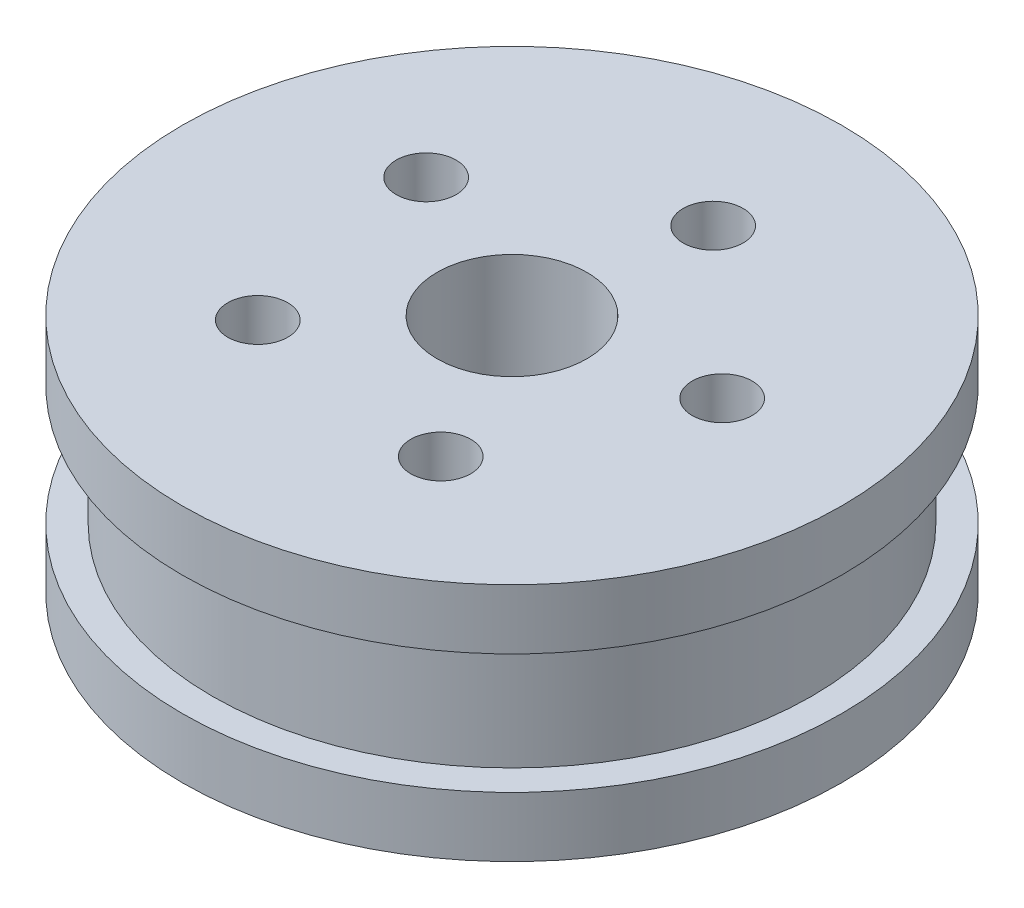
ISO-10303-21;
HEADER;
FILE_DESCRIPTION(('STEP AP214'),'2;1');
FILE_NAME('part.step','',(''),(''),'','','');
FILE_SCHEMA(('AUTOMOTIVE_DESIGN { 1 0 10303 214 1 1 1 1 }'));
ENDSEC;
DATA;
#1=APPLICATION_CONTEXT('core data for automotive mechanical design processes');
#2=APPLICATION_PROTOCOL_DEFINITION('international standard','automotive_design',2000,#1);
#3=PRODUCT_CONTEXT('',#1,'mechanical');
#4=PRODUCT('Part','Part','',(#3));
#5=PRODUCT_RELATED_PRODUCT_CATEGORY('part','',(#4));
#6=PRODUCT_DEFINITION_FORMATION('','',#4);
#7=PRODUCT_DEFINITION_CONTEXT('part definition',#1,'design');
#8=PRODUCT_DEFINITION('design','',#6,#7);
#9=PRODUCT_DEFINITION_SHAPE('','',#8);
#10=(LENGTH_UNIT() NAMED_UNIT(*) SI_UNIT(.MILLI.,.METRE.));
#11=(NAMED_UNIT(*) PLANE_ANGLE_UNIT() SI_UNIT($,.RADIAN.));
#12=(NAMED_UNIT(*) SI_UNIT($,.STERADIAN.) SOLID_ANGLE_UNIT());
#13=UNCERTAINTY_MEASURE_WITH_UNIT(LENGTH_MEASURE(1.E-05),#10,'distance_accuracy_value','');
#14=(GEOMETRIC_REPRESENTATION_CONTEXT(3) GLOBAL_UNCERTAINTY_ASSIGNED_CONTEXT((#13)) GLOBAL_UNIT_ASSIGNED_CONTEXT((#10,
#11,#12)) REPRESENTATION_CONTEXT('',''));
#15=CARTESIAN_POINT('',(0.,0.,0.));
#16=DIRECTION('',(0.,0.,1.));
#17=DIRECTION('',(1.,0.,0.));
#18=AXIS2_PLACEMENT_3D('',#15,#16,#17);
#19=CARTESIAN_POINT('',(1.27,0.,0.));
#20=DIRECTION('',(0.,1.,0.));
#21=DIRECTION('',(0.,0.,1.));
#22=AXIS2_PLACEMENT_3D('',#19,#20,#21);
#23=PLANE('',#22);
#24=CARTESIAN_POINT('',(13.97,0.,0.));
#25=DIRECTION('',(0.,-1.,0.));
#26=DIRECTION('',(0.,0.,-1.));
#27=AXIS2_PLACEMENT_3D('',#24,#25,#26);
#28=CIRCLE('',#27,12.7);
#29=CARTESIAN_POINT('',(13.97,0.,-12.7));
#30=VERTEX_POINT('',#29);
#31=EDGE_CURVE('E65',#30,#30,#28,.T.);
#32=ORIENTED_EDGE('',*,*,#31,.F.);
#33=EDGE_LOOP('',(#32));
#34=FACE_BOUND('',#33,.T.);
#35=CARTESIAN_POINT('',(13.97,0.,0.));
#36=DIRECTION('',(0.,-1.,0.));
#37=DIRECTION('',(0.,0.,-1.));
#38=AXIS2_PLACEMENT_3D('',#35,#36,#37);
#39=CIRCLE('',#38,13.97);
#40=CARTESIAN_POINT('',(13.97,0.,-13.97));
#41=VERTEX_POINT('',#40);
#42=EDGE_CURVE('E10',#41,#41,#39,.T.);
#43=ORIENTED_EDGE('',*,*,#42,.T.);
#44=EDGE_LOOP('',(#43));
#45=FACE_BOUND('',#44,.T.);
#46=ADVANCED_FACE('F34',(#34,#45),#23,.F.);
#47=CARTESIAN_POINT('',(13.97,-7.62,0.));
#48=DIRECTION('',(0.,-1.,0.));
#49=DIRECTION('',(0.,0.,-1.));
#50=AXIS2_PLACEMENT_3D('',#47,#48,#49);
#51=CYLINDRICAL_SURFACE('',#50,13.97);
#52=ORIENTED_EDGE('',*,*,#42,.F.);
#53=EDGE_LOOP('',(#52));
#54=FACE_BOUND('',#53,.T.);
#55=CARTESIAN_POINT('',(13.97,2.54,0.));
#56=DIRECTION('',(0.,-1.,0.));
#57=DIRECTION('',(0.,0.,-1.));
#58=AXIS2_PLACEMENT_3D('',#55,#56,#57);
#59=CIRCLE('',#58,13.97);
#60=CARTESIAN_POINT('',(13.97,2.54,-13.97));
#61=VERTEX_POINT('',#60);
#62=EDGE_CURVE('E41',#61,#61,#59,.T.);
#63=ORIENTED_EDGE('',*,*,#62,.T.);
#64=EDGE_LOOP('',(#63));
#65=FACE_BOUND('',#64,.T.);
#66=ADVANCED_FACE('F128',(#54,#65),#51,.T.);
#67=CARTESIAN_POINT('',(13.97,2.54,0.));
#68=DIRECTION('',(0.,-1.,0.));
#69=DIRECTION('',(0.,0.,-1.));
#70=AXIS2_PLACEMENT_3D('',#67,#68,#69);
#71=PLANE('',#70);
#72=CARTESIAN_POINT('',(8.74676567847199,2.54,5.54817296255369));
#73=DIRECTION('',(0.,1.,0.));
#74=DIRECTION('',(0.,0.,1.));
#75=AXIS2_PLACEMENT_3D('',#72,#73,#74);
#76=CIRCLE('',#75,1.27);
#77=CARTESIAN_POINT('',(8.74676567847199,2.54,6.81817296255369));
#78=VERTEX_POINT('',#77);
#79=EDGE_CURVE('E85',#78,#78,#76,.T.);
#80=ORIENTED_EDGE('',*,*,#79,.F.);
#81=EDGE_LOOP('',(#80));
#82=FACE_BOUND('',#81,.T.);
#83=CARTESIAN_POINT('',(17.6325578786146,2.54,6.68207077078639));
#84=DIRECTION('',(0.,1.,0.));
#85=DIRECTION('',(0.,0.,1.));
#86=AXIS2_PLACEMENT_3D('',#83,#84,#85);
#87=CIRCLE('',#86,1.27);
#88=CARTESIAN_POINT('',(17.6325578786146,2.54,7.95207077078639));
#89=VERTEX_POINT('',#88);
#90=EDGE_CURVE('E92',#89,#89,#87,.T.);
#91=ORIENTED_EDGE('',*,*,#90,.F.);
#92=EDGE_LOOP('',(#91));
#93=FACE_BOUND('',#92,.T.);
#94=CARTESIAN_POINT('',(21.4568195762755,2.54,-1.41842611097553));
#95=DIRECTION('',(0.,1.,0.));
#96=DIRECTION('',(0.,0.,1.));
#97=AXIS2_PLACEMENT_3D('',#94,#95,#96);
#98=CIRCLE('',#97,1.27);
#99=CARTESIAN_POINT('',(21.4568195762755,2.54,-0.148426110975534));
#100=VERTEX_POINT('',#99);
#101=EDGE_CURVE('E99',#100,#100,#98,.T.);
#102=ORIENTED_EDGE('',*,*,#101,.F.);
#103=EDGE_LOOP('',(#102));
#104=FACE_BOUND('',#103,.T.);
#105=CARTESIAN_POINT('',(14.9345510871617,2.54,-7.55870631789959));
#106=DIRECTION('',(0.,1.,0.));
#107=DIRECTION('',(0.,0.,1.));
#108=AXIS2_PLACEMENT_3D('',#105,#106,#107);
#109=CIRCLE('',#108,1.27);
#110=CARTESIAN_POINT('',(14.9345510871617,2.54,-6.28870631789959));
#111=VERTEX_POINT('',#110);
#112=EDGE_CURVE('E106',#111,#111,#109,.T.);
#113=ORIENTED_EDGE('',*,*,#112,.F.);
#114=EDGE_LOOP('',(#113));
#115=FACE_BOUND('',#114,.T.);
#116=CARTESIAN_POINT('',(7.07930577947603,2.54,-3.25311130446494));
#117=DIRECTION('',(0.,1.,0.));
#118=DIRECTION('',(0.,0.,1.));
#119=AXIS2_PLACEMENT_3D('',#116,#117,#118);
#120=CIRCLE('',#119,1.27);
#121=CARTESIAN_POINT('',(7.07930577947603,2.54,-1.98311130446494));
#122=VERTEX_POINT('',#121);
#123=EDGE_CURVE('E77',#122,#122,#120,.T.);
#124=ORIENTED_EDGE('',*,*,#123,.F.);
#125=EDGE_LOOP('',(#124));
#126=FACE_BOUND('',#125,.T.);
#127=CARTESIAN_POINT('',(13.97,2.54,0.));
#128=DIRECTION('',(0.,1.,0.));
#129=DIRECTION('',(0.,0.,1.));
#130=AXIS2_PLACEMENT_3D('',#127,#128,#129);
#131=CIRCLE('',#130,3.17500000000001);
#132=CARTESIAN_POINT('',(13.97,2.54,3.17500000000001));
#133=VERTEX_POINT('',#132);
#134=EDGE_CURVE('E70',#133,#133,#131,.T.);
#135=ORIENTED_EDGE('',*,*,#134,.F.);
#136=EDGE_LOOP('',(#135));
#137=FACE_BOUND('',#136,.T.);
#138=ORIENTED_EDGE('',*,*,#62,.F.);
#139=EDGE_LOOP('',(#138));
#140=FACE_BOUND('',#139,.T.);
#141=ADVANCED_FACE('F125',(#82,#93,#104,#115,#126,#137,#140),#71,.F.);
#142=CARTESIAN_POINT('',(0.,-7.62,0.));
#143=DIRECTION('',(0.,1.,0.));
#144=DIRECTION('',(0.,0.,1.));
#145=AXIS2_PLACEMENT_3D('',#142,#143,#144);
#146=PLANE('',#145);
#147=CARTESIAN_POINT('',(8.74676567847199,-7.62,5.54817296255369));
#148=DIRECTION('',(0.,1.,0.));
#149=DIRECTION('',(0.,0.,1.));
#150=AXIS2_PLACEMENT_3D('',#147,#148,#149);
#151=CIRCLE('',#150,1.27);
#152=CARTESIAN_POINT('',(8.74676567847199,-7.62,6.81817296255369));
#153=VERTEX_POINT('',#152);
#154=EDGE_CURVE('E88',#153,#153,#151,.T.);
#155=ORIENTED_EDGE('',*,*,#154,.T.);
#156=EDGE_LOOP('',(#155));
#157=FACE_BOUND('',#156,.T.);
#158=CARTESIAN_POINT('',(17.6325578786146,-7.62,6.68207077078639));
#159=DIRECTION('',(0.,1.,0.));
#160=DIRECTION('',(0.,0.,1.));
#161=AXIS2_PLACEMENT_3D('',#158,#159,#160);
#162=CIRCLE('',#161,1.27);
#163=CARTESIAN_POINT('',(17.6325578786146,-7.62,7.95207077078639));
#164=VERTEX_POINT('',#163);
#165=EDGE_CURVE('E95',#164,#164,#162,.T.);
#166=ORIENTED_EDGE('',*,*,#165,.T.);
#167=EDGE_LOOP('',(#166));
#168=FACE_BOUND('',#167,.T.);
#169=CARTESIAN_POINT('',(21.4568195762755,-7.62,-1.41842611097553));
#170=DIRECTION('',(0.,1.,0.));
#171=DIRECTION('',(0.,0.,1.));
#172=AXIS2_PLACEMENT_3D('',#169,#170,#171);
#173=CIRCLE('',#172,1.27);
#174=CARTESIAN_POINT('',(21.4568195762755,-7.62,-0.148426110975534));
#175=VERTEX_POINT('',#174);
#176=EDGE_CURVE('E102',#175,#175,#173,.T.);
#177=ORIENTED_EDGE('',*,*,#176,.T.);
#178=EDGE_LOOP('',(#177));
#179=FACE_BOUND('',#178,.T.);
#180=CARTESIAN_POINT('',(14.9345510871617,-7.62,-7.55870631789959));
#181=DIRECTION('',(0.,1.,0.));
#182=DIRECTION('',(0.,0.,1.));
#183=AXIS2_PLACEMENT_3D('',#180,#181,#182);
#184=CIRCLE('',#183,1.27);
#185=CARTESIAN_POINT('',(14.9345510871617,-7.62,-6.28870631789959));
#186=VERTEX_POINT('',#185);
#187=EDGE_CURVE('E81',#186,#186,#184,.T.);
#188=ORIENTED_EDGE('',*,*,#187,.T.);
#189=EDGE_LOOP('',(#188));
#190=FACE_BOUND('',#189,.T.);
#191=CARTESIAN_POINT('',(7.07930577947603,-7.62,-3.25311130446494));
#192=DIRECTION('',(0.,1.,0.));
#193=DIRECTION('',(0.,0.,1.));
#194=AXIS2_PLACEMENT_3D('',#191,#192,#193);
#195=CIRCLE('',#194,1.27);
#196=CARTESIAN_POINT('',(7.07930577947603,-7.62,-1.98311130446494));
#197=VERTEX_POINT('',#196);
#198=EDGE_CURVE('E73',#197,#197,#195,.T.);
#199=ORIENTED_EDGE('',*,*,#198,.T.);
#200=EDGE_LOOP('',(#199));
#201=FACE_BOUND('',#200,.T.);
#202=CARTESIAN_POINT('',(13.97,-7.62,0.));
#203=DIRECTION('',(0.,1.,0.));
#204=DIRECTION('',(0.,0.,1.));
#205=AXIS2_PLACEMENT_3D('',#202,#203,#204);
#206=CIRCLE('',#205,3.17500000000001);
#207=CARTESIAN_POINT('',(13.97,-7.62,3.17500000000001));
#208=VERTEX_POINT('',#207);
#209=EDGE_CURVE('E69',#208,#208,#206,.T.);
#210=ORIENTED_EDGE('',*,*,#209,.T.);
#211=EDGE_LOOP('',(#210));
#212=FACE_BOUND('',#211,.T.);
#213=CARTESIAN_POINT('',(13.97,-7.62,0.));
#214=DIRECTION('',(0.,-1.,0.));
#215=DIRECTION('',(0.,0.,-1.));
#216=AXIS2_PLACEMENT_3D('',#213,#214,#215);
#217=CIRCLE('',#216,13.97);
#218=CARTESIAN_POINT('',(13.97,-7.62,-13.97));
#219=VERTEX_POINT('',#218);
#220=EDGE_CURVE('E48',#219,#219,#217,.T.);
#221=ORIENTED_EDGE('',*,*,#220,.T.);
#222=EDGE_LOOP('',(#221));
#223=FACE_BOUND('',#222,.T.);
#224=ADVANCED_FACE('F114',(#157,#168,#179,#190,#201,#212,#223),#146,.F.);
#225=CARTESIAN_POINT('',(13.97,-7.62,0.));
#226=DIRECTION('',(0.,-1.,0.));
#227=DIRECTION('',(0.,0.,-1.));
#228=AXIS2_PLACEMENT_3D('',#225,#226,#227);
#229=CYLINDRICAL_SURFACE('',#228,13.97);
#230=ORIENTED_EDGE('',*,*,#220,.F.);
#231=EDGE_LOOP('',(#230));
#232=FACE_BOUND('',#231,.T.);
#233=CARTESIAN_POINT('',(13.97,-5.08,0.));
#234=DIRECTION('',(0.,-1.,0.));
#235=DIRECTION('',(0.,0.,-1.));
#236=AXIS2_PLACEMENT_3D('',#233,#234,#235);
#237=CIRCLE('',#236,13.97);
#238=CARTESIAN_POINT('',(13.97,-5.08,-13.97));
#239=VERTEX_POINT('',#238);
#240=EDGE_CURVE('E55',#239,#239,#237,.T.);
#241=ORIENTED_EDGE('',*,*,#240,.T.);
#242=EDGE_LOOP('',(#241));
#243=FACE_BOUND('',#242,.T.);
#244=ADVANCED_FACE('F164',(#232,#243),#229,.T.);
#245=CARTESIAN_POINT('',(0.,-5.08,0.));
#246=DIRECTION('',(0.,-1.,0.));
#247=DIRECTION('',(0.,0.,-1.));
#248=AXIS2_PLACEMENT_3D('',#245,#246,#247);
#249=PLANE('',#248);
#250=ORIENTED_EDGE('',*,*,#240,.F.);
#251=EDGE_LOOP('',(#250));
#252=FACE_BOUND('',#251,.T.);
#253=CARTESIAN_POINT('',(13.97,-5.08,0.));
#254=DIRECTION('',(0.,-1.,0.));
#255=DIRECTION('',(0.,0.,-1.));
#256=AXIS2_PLACEMENT_3D('',#253,#254,#255);
#257=CIRCLE('',#256,12.7);
#258=CARTESIAN_POINT('',(13.97,-5.08,-12.7));
#259=VERTEX_POINT('',#258);
#260=EDGE_CURVE('E61',#259,#259,#257,.T.);
#261=ORIENTED_EDGE('',*,*,#260,.T.);
#262=EDGE_LOOP('',(#261));
#263=FACE_BOUND('',#262,.T.);
#264=ADVANCED_FACE('F147',(#252,#263),#249,.F.);
#265=CARTESIAN_POINT('',(13.97,-7.62,0.));
#266=DIRECTION('',(0.,-1.,0.));
#267=DIRECTION('',(0.,0.,-1.));
#268=AXIS2_PLACEMENT_3D('',#265,#266,#267);
#269=CYLINDRICAL_SURFACE('',#268,12.7);
#270=ORIENTED_EDGE('',*,*,#260,.F.);
#271=EDGE_LOOP('',(#270));
#272=FACE_BOUND('',#271,.T.);
#273=ORIENTED_EDGE('',*,*,#31,.T.);
#274=EDGE_LOOP('',(#273));
#275=FACE_BOUND('',#274,.T.);
#276=ADVANCED_FACE('F138',(#272,#275),#269,.T.);
#277=CARTESIAN_POINT('',(13.97,-7.62,0.));
#278=DIRECTION('',(0.,1.,0.));
#279=DIRECTION('',(0.,0.,1.));
#280=AXIS2_PLACEMENT_3D('',#277,#278,#279);
#281=CYLINDRICAL_SURFACE('',#280,3.17500000000001);
#282=ORIENTED_EDGE('',*,*,#209,.F.);
#283=EDGE_LOOP('',(#282));
#284=FACE_BOUND('',#283,.T.);
#285=ORIENTED_EDGE('',*,*,#134,.T.);
#286=EDGE_LOOP('',(#285));
#287=FACE_BOUND('',#286,.T.);
#288=ADVANCED_FACE('F136',(#284,#287),#281,.F.);
#289=CARTESIAN_POINT('',(7.07930577947603,-7.62,-3.25311130446494));
#290=DIRECTION('',(0.,1.,0.));
#291=DIRECTION('',(0.,0.,1.));
#292=AXIS2_PLACEMENT_3D('',#289,#290,#291);
#293=CYLINDRICAL_SURFACE('',#292,1.27);
#294=ORIENTED_EDGE('',*,*,#198,.F.);
#295=EDGE_LOOP('',(#294));
#296=FACE_BOUND('',#295,.T.);
#297=ORIENTED_EDGE('',*,*,#123,.T.);
#298=EDGE_LOOP('',(#297));
#299=FACE_BOUND('',#298,.T.);
#300=ADVANCED_FACE('F121',(#296,#299),#293,.F.);
#301=CARTESIAN_POINT('',(14.9345510871617,-7.62,-7.55870631789959));
#302=DIRECTION('',(0.,1.,0.));
#303=DIRECTION('',(0.,0.,1.));
#304=AXIS2_PLACEMENT_3D('',#301,#302,#303);
#305=CYLINDRICAL_SURFACE('',#304,1.27);
#306=ORIENTED_EDGE('',*,*,#187,.F.);
#307=EDGE_LOOP('',(#306));
#308=FACE_BOUND('',#307,.T.);
#309=ORIENTED_EDGE('',*,*,#112,.T.);
#310=EDGE_LOOP('',(#309));
#311=FACE_BOUND('',#310,.T.);
#312=ADVANCED_FACE('F117',(#308,#311),#305,.F.);
#313=CARTESIAN_POINT('',(21.4568195762755,-7.62,-1.41842611097553));
#314=DIRECTION('',(0.,1.,0.));
#315=DIRECTION('',(0.,0.,1.));
#316=AXIS2_PLACEMENT_3D('',#313,#314,#315);
#317=CYLINDRICAL_SURFACE('',#316,1.27);
#318=ORIENTED_EDGE('',*,*,#176,.F.);
#319=EDGE_LOOP('',(#318));
#320=FACE_BOUND('',#319,.T.);
#321=ORIENTED_EDGE('',*,*,#101,.T.);
#322=EDGE_LOOP('',(#321));
#323=FACE_BOUND('',#322,.T.);
#324=ADVANCED_FACE('F120',(#320,#323),#317,.F.);
#325=CARTESIAN_POINT('',(17.6325578786146,-7.62,6.68207077078639));
#326=DIRECTION('',(0.,1.,0.));
#327=DIRECTION('',(0.,0.,1.));
#328=AXIS2_PLACEMENT_3D('',#325,#326,#327);
#329=CYLINDRICAL_SURFACE('',#328,1.27);
#330=ORIENTED_EDGE('',*,*,#165,.F.);
#331=EDGE_LOOP('',(#330));
#332=FACE_BOUND('',#331,.T.);
#333=ORIENTED_EDGE('',*,*,#90,.T.);
#334=EDGE_LOOP('',(#333));
#335=FACE_BOUND('',#334,.T.);
#336=ADVANCED_FACE('F223',(#332,#335),#329,.F.);
#337=CARTESIAN_POINT('',(8.74676567847199,-7.62,5.54817296255369));
#338=DIRECTION('',(0.,1.,0.));
#339=DIRECTION('',(0.,0.,1.));
#340=AXIS2_PLACEMENT_3D('',#337,#338,#339);
#341=CYLINDRICAL_SURFACE('',#340,1.27);
#342=ORIENTED_EDGE('',*,*,#154,.F.);
#343=EDGE_LOOP('',(#342));
#344=FACE_BOUND('',#343,.T.);
#345=ORIENTED_EDGE('',*,*,#79,.T.);
#346=EDGE_LOOP('',(#345));
#347=FACE_BOUND('',#346,.T.);
#348=ADVANCED_FACE('F233',(#344,#347),#341,.F.);
#349=CLOSED_SHELL('',(#46,#66,#141,#224,#244,#264,#276,#288,#300,#312,#324,#336,#348));
#350=MANIFOLD_SOLID_BREP('B2',#349);
#351=ADVANCED_BREP_SHAPE_REPRESENTATION('',(#18,#350),#14);
#352=SHAPE_DEFINITION_REPRESENTATION(#9,#351);
ENDSEC;
END-ISO-10303-21;
